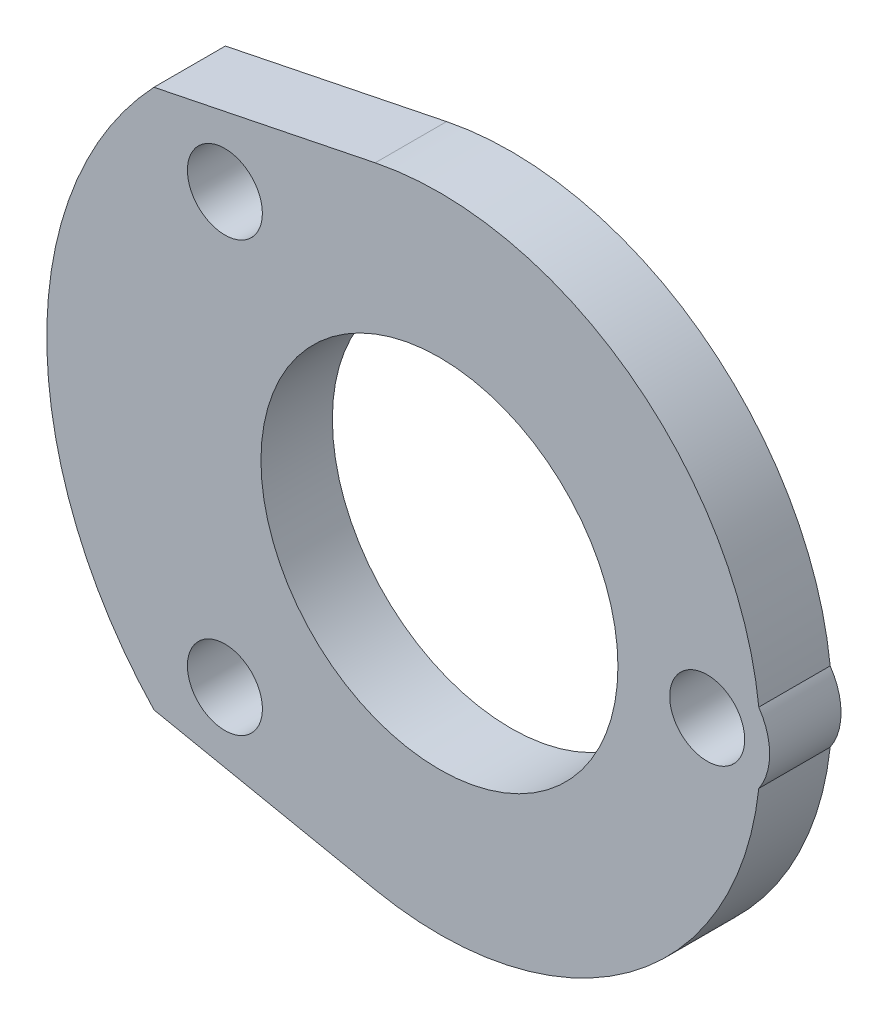
ISO-10303-21;
HEADER;
FILE_DESCRIPTION(('STEP AP214'),'2;1');
FILE_NAME('part.step','',(''),(''),'','','');
FILE_SCHEMA(('AUTOMOTIVE_DESIGN { 1 0 10303 214 1 1 1 1 }'));
ENDSEC;
DATA;
#1=APPLICATION_CONTEXT('core data for automotive mechanical design processes');
#2=APPLICATION_PROTOCOL_DEFINITION('international standard','automotive_design',2000,#1);
#3=PRODUCT_CONTEXT('',#1,'mechanical');
#4=PRODUCT('Part','Part','',(#3));
#5=PRODUCT_RELATED_PRODUCT_CATEGORY('part','',(#4));
#6=PRODUCT_DEFINITION_FORMATION('','',#4);
#7=PRODUCT_DEFINITION_CONTEXT('part definition',#1,'design');
#8=PRODUCT_DEFINITION('design','',#6,#7);
#9=PRODUCT_DEFINITION_SHAPE('','',#8);
#10=(LENGTH_UNIT() NAMED_UNIT(*) SI_UNIT(.MILLI.,.METRE.));
#11=(NAMED_UNIT(*) PLANE_ANGLE_UNIT() SI_UNIT($,.RADIAN.));
#12=(NAMED_UNIT(*) SI_UNIT($,.STERADIAN.) SOLID_ANGLE_UNIT());
#13=UNCERTAINTY_MEASURE_WITH_UNIT(LENGTH_MEASURE(1.E-05),#10,'distance_accuracy_value','');
#14=(GEOMETRIC_REPRESENTATION_CONTEXT(3) GLOBAL_UNCERTAINTY_ASSIGNED_CONTEXT((#13)) GLOBAL_UNIT_ASSIGNED_CONTEXT((#10,
#11,#12)) REPRESENTATION_CONTEXT('',''));
#15=CARTESIAN_POINT('',(0.,0.,0.));
#16=DIRECTION('',(0.,0.,1.));
#17=DIRECTION('',(1.,0.,0.));
#18=AXIS2_PLACEMENT_3D('',#15,#16,#17);
#19=CARTESIAN_POINT('',(0.,0.,2.));
#20=DIRECTION('',(0.,0.,-1.));
#21=DIRECTION('',(-1.,0.,0.));
#22=AXIS2_PLACEMENT_3D('',#19,#20,#21);
#23=PLANE('',#22);
#24=CARTESIAN_POINT('',(0.,0.,2.));
#25=DIRECTION('',(0.,0.,1.));
#26=DIRECTION('',(-1.,0.,0.));
#27=AXIS2_PLACEMENT_3D('',#24,#25,#26);
#28=CIRCLE('',#27,9.);
#29=CARTESIAN_POINT('',(8.94583333333333,0.985934060788161,2.));
#30=VERTEX_POINT('',#29);
#31=CARTESIAN_POINT('',(-1.8,8.81816307401944,2.));
#32=VERTEX_POINT('',#31);
#33=EDGE_CURVE('E131',#30,#32,#28,.T.);
#34=ORIENTED_EDGE('',*,*,#33,.T.);
#35=DIRECTION('',(-0.979795897113271,-0.2,0.));
#36=VECTOR('',#35,1.);
#37=CARTESIAN_POINT('',(-7.99677335393187,7.55325200995209,2.));
#38=LINE('',#37,#36);
#39=CARTESIAN_POINT('',(-7.99677335393187,7.55325200995209,2.));
#40=VERTEX_POINT('',#39);
#41=EDGE_CURVE('E89',#32,#40,#38,.T.);
#42=ORIENTED_EDGE('',*,*,#41,.T.);
#43=CARTESIAN_POINT('',(0.,0.,2.));
#44=DIRECTION('',(0.,0.,1.));
#45=DIRECTION('',(1.,0.,0.));
#46=AXIS2_PLACEMENT_3D('',#43,#44,#45);
#47=CIRCLE('',#46,11.);
#48=CARTESIAN_POINT('',(-7.99677335393187,-7.55325200995209,2.));
#49=VERTEX_POINT('',#48);
#50=EDGE_CURVE('E102',#40,#49,#47,.T.);
#51=ORIENTED_EDGE('',*,*,#50,.T.);
#52=DIRECTION('',(0.979795897113271,-0.2,0.));
#53=VECTOR('',#52,1.);
#54=CARTESIAN_POINT('',(-7.99677335393187,-7.55325200995209,2.));
#55=LINE('',#54,#53);
#56=CARTESIAN_POINT('',(-1.8,-8.81816307401944,2.));
#57=VERTEX_POINT('',#56);
#58=EDGE_CURVE('E96',#49,#57,#55,.T.);
#59=ORIENTED_EDGE('',*,*,#58,.T.);
#60=CARTESIAN_POINT('',(0.,0.,2.));
#61=DIRECTION('',(0.,0.,1.));
#62=DIRECTION('',(1.,0.,0.));
#63=AXIS2_PLACEMENT_3D('',#60,#61,#62);
#64=CIRCLE('',#63,9.);
#65=CARTESIAN_POINT('',(8.94583333333333,-0.985934060788165,2.));
#66=VERTEX_POINT('',#65);
#67=EDGE_CURVE('E100',#57,#66,#64,.T.);
#68=ORIENTED_EDGE('',*,*,#67,.T.);
#69=CARTESIAN_POINT('',(7.5,0.,2.));
#70=DIRECTION('',(0.,0.,1.));
#71=DIRECTION('',(-1.,0.,0.));
#72=AXIS2_PLACEMENT_3D('',#69,#70,#71);
#73=CIRCLE('',#72,1.75);
#74=EDGE_CURVE('E52',#66,#30,#73,.T.);
#75=ORIENTED_EDGE('',*,*,#74,.T.);
#76=EDGE_LOOP('',(#34,#42,#51,#59,#68,#75));
#77=FACE_BOUND('',#76,.T.);
#78=CARTESIAN_POINT('',(0.,0.,2.));
#79=DIRECTION('',(0.,0.,1.));
#80=DIRECTION('',(1.,0.,0.));
#81=AXIS2_PLACEMENT_3D('',#78,#79,#80);
#82=CIRCLE('',#81,5.);
#83=CARTESIAN_POINT('',(5.,0.,2.));
#84=VERTEX_POINT('',#83);
#85=EDGE_CURVE('E124',#84,#84,#82,.T.);
#86=ORIENTED_EDGE('',*,*,#85,.F.);
#87=EDGE_LOOP('',(#86));
#88=FACE_BOUND('',#87,.T.);
#89=CARTESIAN_POINT('',(7.5,0.,2.));
#90=DIRECTION('',(0.,0.,1.));
#91=DIRECTION('',(1.,0.,0.));
#92=AXIS2_PLACEMENT_3D('',#89,#90,#91);
#93=CIRCLE('',#92,1.05);
#94=CARTESIAN_POINT('',(8.55,0.,2.));
#95=VERTEX_POINT('',#94);
#96=EDGE_CURVE('E195',#95,#95,#93,.T.);
#97=ORIENTED_EDGE('',*,*,#96,.F.);
#98=EDGE_LOOP('',(#97));
#99=FACE_BOUND('',#98,.T.);
#100=CARTESIAN_POINT('',(-6.01040764008569,6.01040764008562,2.));
#101=DIRECTION('',(0.,0.,1.));
#102=DIRECTION('',(1.,0.,0.));
#103=AXIS2_PLACEMENT_3D('',#100,#101,#102);
#104=CIRCLE('',#103,1.05);
#105=CARTESIAN_POINT('',(-4.96040764008569,6.01040764008562,2.));
#106=VERTEX_POINT('',#105);
#107=EDGE_CURVE('E189',#106,#106,#104,.T.);
#108=ORIENTED_EDGE('',*,*,#107,.F.);
#109=EDGE_LOOP('',(#108));
#110=FACE_BOUND('',#109,.T.);
#111=CARTESIAN_POINT('',(-6.01040764008569,-6.01040764008562,2.));
#112=DIRECTION('',(0.,0.,1.));
#113=DIRECTION('',(-1.,0.,0.));
#114=AXIS2_PLACEMENT_3D('',#111,#112,#113);
#115=CIRCLE('',#114,1.05);
#116=CARTESIAN_POINT('',(-7.06040764008569,-6.01040764008562,2.));
#117=VERTEX_POINT('',#116);
#118=EDGE_CURVE('E180',#117,#117,#115,.T.);
#119=ORIENTED_EDGE('',*,*,#118,.F.);
#120=EDGE_LOOP('',(#119));
#121=FACE_BOUND('',#120,.T.);
#122=ADVANCED_FACE('F35',(#77,#88,#99,#110,#121),#23,.F.);
#123=CARTESIAN_POINT('',(0.,0.,0.));
#124=DIRECTION('',(0.,0.,-1.));
#125=DIRECTION('',(-1.,0.,0.));
#126=AXIS2_PLACEMENT_3D('',#123,#124,#125);
#127=PLANE('',#126);
#128=CARTESIAN_POINT('',(-6.01040764008569,6.01040764008562,0.));
#129=DIRECTION('',(0.,0.,1.));
#130=DIRECTION('',(1.,0.,0.));
#131=AXIS2_PLACEMENT_3D('',#128,#129,#130);
#132=CIRCLE('',#131,1.05);
#133=CARTESIAN_POINT('',(-4.96040764008569,6.01040764008562,0.));
#134=VERTEX_POINT('',#133);
#135=EDGE_CURVE('E186',#134,#134,#132,.T.);
#136=ORIENTED_EDGE('',*,*,#135,.T.);
#137=EDGE_LOOP('',(#136));
#138=FACE_BOUND('',#137,.T.);
#139=CARTESIAN_POINT('',(0.,0.,0.));
#140=DIRECTION('',(0.,0.,1.));
#141=DIRECTION('',(1.,0.,0.));
#142=AXIS2_PLACEMENT_3D('',#139,#140,#141);
#143=CIRCLE('',#142,5.);
#144=CARTESIAN_POINT('',(5.,0.,0.));
#145=VERTEX_POINT('',#144);
#146=EDGE_CURVE('E198',#145,#145,#143,.T.);
#147=ORIENTED_EDGE('',*,*,#146,.T.);
#148=EDGE_LOOP('',(#147));
#149=FACE_BOUND('',#148,.T.);
#150=CARTESIAN_POINT('',(0.,0.,0.));
#151=DIRECTION('',(0.,0.,1.));
#152=DIRECTION('',(-1.,0.,0.));
#153=AXIS2_PLACEMENT_3D('',#150,#151,#152);
#154=CIRCLE('',#153,9.);
#155=CARTESIAN_POINT('',(8.94583333333333,0.985934060788161,0.));
#156=VERTEX_POINT('',#155);
#157=CARTESIAN_POINT('',(-1.8,8.81816307401944,0.));
#158=VERTEX_POINT('',#157);
#159=EDGE_CURVE('E120',#156,#158,#154,.T.);
#160=ORIENTED_EDGE('',*,*,#159,.F.);
#161=CARTESIAN_POINT('',(7.5,0.,0.));
#162=DIRECTION('',(0.,0.,1.));
#163=DIRECTION('',(-1.,0.,0.));
#164=AXIS2_PLACEMENT_3D('',#161,#162,#163);
#165=CIRCLE('',#164,1.75);
#166=CARTESIAN_POINT('',(8.94583333333333,-0.985934060788165,0.));
#167=VERTEX_POINT('',#166);
#168=EDGE_CURVE('E81',#167,#156,#165,.T.);
#169=ORIENTED_EDGE('',*,*,#168,.F.);
#170=CARTESIAN_POINT('',(0.,0.,0.));
#171=DIRECTION('',(0.,0.,1.));
#172=DIRECTION('',(1.,0.,0.));
#173=AXIS2_PLACEMENT_3D('',#170,#171,#172);
#174=CIRCLE('',#173,9.);
#175=CARTESIAN_POINT('',(-1.8,-8.81816307401944,0.));
#176=VERTEX_POINT('',#175);
#177=EDGE_CURVE('E75',#176,#167,#174,.T.);
#178=ORIENTED_EDGE('',*,*,#177,.F.);
#179=DIRECTION('',(0.979795897113271,-0.2,0.));
#180=VECTOR('',#179,1.);
#181=CARTESIAN_POINT('',(-7.99677335393187,-7.55325200995209,0.));
#182=LINE('',#181,#180);
#183=CARTESIAN_POINT('',(-7.99677335393187,-7.55325200995209,0.));
#184=VERTEX_POINT('',#183);
#185=EDGE_CURVE('E110',#184,#176,#182,.T.);
#186=ORIENTED_EDGE('',*,*,#185,.F.);
#187=CARTESIAN_POINT('',(0.,0.,0.));
#188=DIRECTION('',(0.,0.,1.));
#189=DIRECTION('',(1.,0.,0.));
#190=AXIS2_PLACEMENT_3D('',#187,#188,#189);
#191=CIRCLE('',#190,11.);
#192=CARTESIAN_POINT('',(-7.99677335393187,7.55325200995209,0.));
#193=VERTEX_POINT('',#192);
#194=EDGE_CURVE('E126',#193,#184,#191,.T.);
#195=ORIENTED_EDGE('',*,*,#194,.F.);
#196=DIRECTION('',(-0.979795897113271,-0.2,0.));
#197=VECTOR('',#196,1.);
#198=CARTESIAN_POINT('',(-7.99677335393187,7.55325200995209,0.));
#199=LINE('',#198,#197);
#200=EDGE_CURVE('E123',#158,#193,#199,.T.);
#201=ORIENTED_EDGE('',*,*,#200,.F.);
#202=EDGE_LOOP('',(#160,#169,#178,#186,#195,#201));
#203=FACE_BOUND('',#202,.T.);
#204=CARTESIAN_POINT('',(7.5,0.,0.));
#205=DIRECTION('',(0.,0.,1.));
#206=DIRECTION('',(1.,0.,0.));
#207=AXIS2_PLACEMENT_3D('',#204,#205,#206);
#208=CIRCLE('',#207,1.05);
#209=CARTESIAN_POINT('',(8.55,0.,0.));
#210=VERTEX_POINT('',#209);
#211=EDGE_CURVE('E192',#210,#210,#208,.T.);
#212=ORIENTED_EDGE('',*,*,#211,.T.);
#213=EDGE_LOOP('',(#212));
#214=FACE_BOUND('',#213,.T.);
#215=CARTESIAN_POINT('',(-6.01040764008569,-6.01040764008562,0.));
#216=DIRECTION('',(0.,0.,1.));
#217=DIRECTION('',(-1.,0.,0.));
#218=AXIS2_PLACEMENT_3D('',#215,#216,#217);
#219=CIRCLE('',#218,1.05);
#220=CARTESIAN_POINT('',(-7.06040764008569,-6.01040764008562,0.));
#221=VERTEX_POINT('',#220);
#222=EDGE_CURVE('E183',#221,#221,#219,.T.);
#223=ORIENTED_EDGE('',*,*,#222,.T.);
#224=EDGE_LOOP('',(#223));
#225=FACE_BOUND('',#224,.T.);
#226=ADVANCED_FACE('F140',(#138,#149,#203,#214,#225),#127,.T.);
#227=CARTESIAN_POINT('',(0.,0.,2.));
#228=DIRECTION('',(0.,0.,-1.));
#229=DIRECTION('',(-1.,0.,0.));
#230=AXIS2_PLACEMENT_3D('',#227,#228,#229);
#231=CYLINDRICAL_SURFACE('',#230,9.);
#232=ORIENTED_EDGE('',*,*,#159,.T.);
#233=DIRECTION('',(0.,0.,-1.));
#234=VECTOR('',#233,1.);
#235=CARTESIAN_POINT('',(-1.8,8.81816307401944,2.));
#236=LINE('',#235,#234);
#237=EDGE_CURVE('E11',#32,#158,#236,.T.);
#238=ORIENTED_EDGE('',*,*,#237,.F.);
#239=ORIENTED_EDGE('',*,*,#33,.F.);
#240=DIRECTION('',(0.,0.,-1.));
#241=VECTOR('',#240,1.);
#242=CARTESIAN_POINT('',(8.94583333333333,0.985934060788161,2.));
#243=LINE('',#242,#241);
#244=EDGE_CURVE('E116',#30,#156,#243,.T.);
#245=ORIENTED_EDGE('',*,*,#244,.T.);
#246=EDGE_LOOP('',(#232,#238,#239,#245));
#247=FACE_BOUND('',#246,.T.);
#248=ADVANCED_FACE('F37',(#247),#231,.T.);
#249=CARTESIAN_POINT('',(-7.99677335393187,7.55325200995209,2.));
#250=DIRECTION('',(0.2,-0.979795897113271,0.));
#251=DIRECTION('',(0.979795897113271,0.2,0.));
#252=AXIS2_PLACEMENT_3D('',#249,#250,#251);
#253=PLANE('',#252);
#254=ORIENTED_EDGE('',*,*,#200,.T.);
#255=DIRECTION('',(0.,0.,-1.));
#256=VECTOR('',#255,1.);
#257=CARTESIAN_POINT('',(-7.99677335393187,7.55325200995209,2.));
#258=LINE('',#257,#256);
#259=EDGE_CURVE('E44',#40,#193,#258,.T.);
#260=ORIENTED_EDGE('',*,*,#259,.F.);
#261=ORIENTED_EDGE('',*,*,#41,.F.);
#262=ORIENTED_EDGE('',*,*,#237,.T.);
#263=EDGE_LOOP('',(#254,#260,#261,#262));
#264=FACE_BOUND('',#263,.T.);
#265=ADVANCED_FACE('F258',(#264),#253,.F.);
#266=CARTESIAN_POINT('',(0.,0.,2.));
#267=DIRECTION('',(0.,0.,-1.));
#268=DIRECTION('',(-1.,0.,0.));
#269=AXIS2_PLACEMENT_3D('',#266,#267,#268);
#270=CYLINDRICAL_SURFACE('',#269,11.);
#271=ORIENTED_EDGE('',*,*,#194,.T.);
#272=DIRECTION('',(0.,0.,-1.));
#273=VECTOR('',#272,1.);
#274=CARTESIAN_POINT('',(-7.99677335393187,-7.55325200995209,2.));
#275=LINE('',#274,#273);
#276=EDGE_CURVE('E111',#49,#184,#275,.T.);
#277=ORIENTED_EDGE('',*,*,#276,.F.);
#278=ORIENTED_EDGE('',*,*,#50,.F.);
#279=ORIENTED_EDGE('',*,*,#259,.T.);
#280=EDGE_LOOP('',(#271,#277,#278,#279));
#281=FACE_BOUND('',#280,.T.);
#282=ADVANCED_FACE('F137',(#281),#270,.T.);
#283=CARTESIAN_POINT('',(-7.99677335393187,-7.55325200995209,2.));
#284=DIRECTION('',(0.2,0.979795897113271,0.));
#285=DIRECTION('',(-0.979795897113271,0.2,0.));
#286=AXIS2_PLACEMENT_3D('',#283,#284,#285);
#287=PLANE('',#286);
#288=ORIENTED_EDGE('',*,*,#185,.T.);
#289=DIRECTION('',(0.,0.,-1.));
#290=VECTOR('',#289,1.);
#291=CARTESIAN_POINT('',(-1.8,-8.81816307401944,2.));
#292=LINE('',#291,#290);
#293=EDGE_CURVE('E107',#57,#176,#292,.T.);
#294=ORIENTED_EDGE('',*,*,#293,.F.);
#295=ORIENTED_EDGE('',*,*,#58,.F.);
#296=ORIENTED_EDGE('',*,*,#276,.T.);
#297=EDGE_LOOP('',(#288,#294,#295,#296));
#298=FACE_BOUND('',#297,.T.);
#299=ADVANCED_FACE('F108',(#298),#287,.F.);
#300=CARTESIAN_POINT('',(0.,0.,2.));
#301=DIRECTION('',(0.,0.,-1.));
#302=DIRECTION('',(-1.,0.,0.));
#303=AXIS2_PLACEMENT_3D('',#300,#301,#302);
#304=CYLINDRICAL_SURFACE('',#303,9.);
#305=ORIENTED_EDGE('',*,*,#177,.T.);
#306=DIRECTION('',(0.,0.,-1.));
#307=VECTOR('',#306,1.);
#308=CARTESIAN_POINT('',(8.94583333333333,-0.985934060788165,2.));
#309=LINE('',#308,#307);
#310=EDGE_CURVE('E112',#66,#167,#309,.T.);
#311=ORIENTED_EDGE('',*,*,#310,.F.);
#312=ORIENTED_EDGE('',*,*,#67,.F.);
#313=ORIENTED_EDGE('',*,*,#293,.T.);
#314=EDGE_LOOP('',(#305,#311,#312,#313));
#315=FACE_BOUND('',#314,.T.);
#316=ADVANCED_FACE('F114',(#315),#304,.T.);
#317=CARTESIAN_POINT('',(7.5,0.,2.));
#318=DIRECTION('',(0.,0.,-1.));
#319=DIRECTION('',(-1.,0.,0.));
#320=AXIS2_PLACEMENT_3D('',#317,#318,#319);
#321=CYLINDRICAL_SURFACE('',#320,1.75);
#322=ORIENTED_EDGE('',*,*,#168,.T.);
#323=ORIENTED_EDGE('',*,*,#244,.F.);
#324=ORIENTED_EDGE('',*,*,#74,.F.);
#325=ORIENTED_EDGE('',*,*,#310,.T.);
#326=EDGE_LOOP('',(#322,#323,#324,#325));
#327=FACE_BOUND('',#326,.T.);
#328=ADVANCED_FACE('F145',(#327),#321,.T.);
#329=CARTESIAN_POINT('',(0.,0.,2.));
#330=DIRECTION('',(0.,0.,-1.));
#331=DIRECTION('',(-1.,0.,0.));
#332=AXIS2_PLACEMENT_3D('',#329,#330,#331);
#333=CYLINDRICAL_SURFACE('',#332,5.);
#334=ORIENTED_EDGE('',*,*,#85,.T.);
#335=EDGE_LOOP('',(#334));
#336=FACE_BOUND('',#335,.T.);
#337=ORIENTED_EDGE('',*,*,#146,.F.);
#338=EDGE_LOOP('',(#337));
#339=FACE_BOUND('',#338,.T.);
#340=ADVANCED_FACE('F147',(#336,#339),#333,.F.);
#341=CARTESIAN_POINT('',(7.5,0.,2.));
#342=DIRECTION('',(0.,0.,-1.));
#343=DIRECTION('',(-1.,0.,0.));
#344=AXIS2_PLACEMENT_3D('',#341,#342,#343);
#345=CYLINDRICAL_SURFACE('',#344,1.05);
#346=ORIENTED_EDGE('',*,*,#96,.T.);
#347=EDGE_LOOP('',(#346));
#348=FACE_BOUND('',#347,.T.);
#349=ORIENTED_EDGE('',*,*,#211,.F.);
#350=EDGE_LOOP('',(#349));
#351=FACE_BOUND('',#350,.T.);
#352=ADVANCED_FACE('F153',(#348,#351),#345,.F.);
#353=CARTESIAN_POINT('',(-6.01040764008569,6.01040764008562,2.));
#354=DIRECTION('',(0.,0.,-1.));
#355=DIRECTION('',(-1.,0.,0.));
#356=AXIS2_PLACEMENT_3D('',#353,#354,#355);
#357=CYLINDRICAL_SURFACE('',#356,1.05);
#358=ORIENTED_EDGE('',*,*,#107,.T.);
#359=EDGE_LOOP('',(#358));
#360=FACE_BOUND('',#359,.T.);
#361=ORIENTED_EDGE('',*,*,#135,.F.);
#362=EDGE_LOOP('',(#361));
#363=FACE_BOUND('',#362,.T.);
#364=ADVANCED_FACE('F167',(#360,#363),#357,.F.);
#365=CARTESIAN_POINT('',(-6.01040764008569,-6.01040764008562,2.));
#366=DIRECTION('',(0.,0.,-1.));
#367=DIRECTION('',(-1.,0.,0.));
#368=AXIS2_PLACEMENT_3D('',#365,#366,#367);
#369=CYLINDRICAL_SURFACE('',#368,1.05);
#370=ORIENTED_EDGE('',*,*,#118,.T.);
#371=EDGE_LOOP('',(#370));
#372=FACE_BOUND('',#371,.T.);
#373=ORIENTED_EDGE('',*,*,#222,.F.);
#374=EDGE_LOOP('',(#373));
#375=FACE_BOUND('',#374,.T.);
#376=ADVANCED_FACE('F171',(#372,#375),#369,.F.);
#377=CLOSED_SHELL('',(#122,#226,#248,#265,#282,#299,#316,#328,#340,#352,#364,#376));
#378=MANIFOLD_SOLID_BREP('B2',#377);
#379=ADVANCED_BREP_SHAPE_REPRESENTATION('',(#18,#378),#14);
#380=SHAPE_DEFINITION_REPRESENTATION(#9,#379);
ENDSEC;
END-ISO-10303-21;
